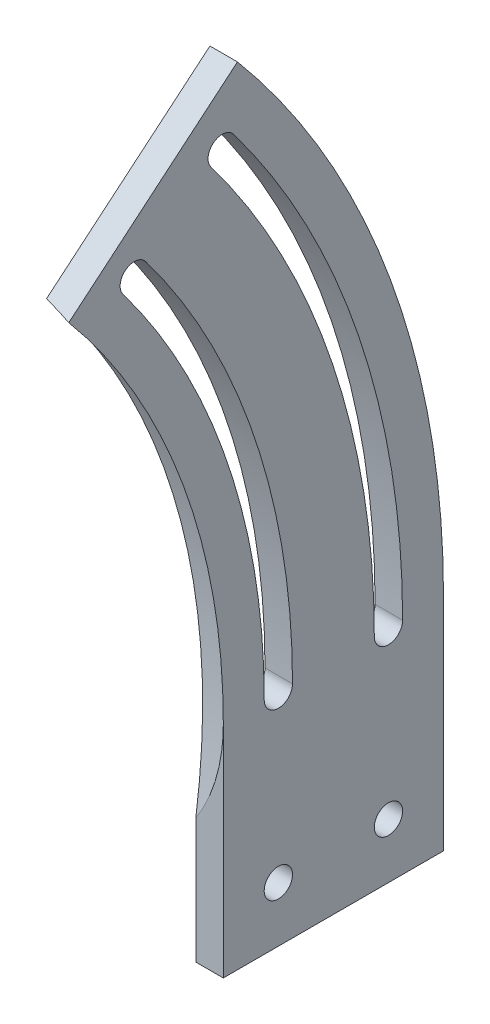
ISO-10303-21;
HEADER;
FILE_DESCRIPTION(('STEP AP214'),'2;1');
FILE_NAME('part.step','',(''),(''),'','','');
FILE_SCHEMA(('AUTOMOTIVE_DESIGN { 1 0 10303 214 1 1 1 1 }'));
ENDSEC;
DATA;
#1=APPLICATION_CONTEXT('core data for automotive mechanical design processes');
#2=APPLICATION_PROTOCOL_DEFINITION('international standard','automotive_design',2000,#1);
#3=PRODUCT_CONTEXT('',#1,'mechanical');
#4=PRODUCT('Part','Part','',(#3));
#5=PRODUCT_RELATED_PRODUCT_CATEGORY('part','',(#4));
#6=PRODUCT_DEFINITION_FORMATION('','',#4);
#7=PRODUCT_DEFINITION_CONTEXT('part definition',#1,'design');
#8=PRODUCT_DEFINITION('design','',#6,#7);
#9=PRODUCT_DEFINITION_SHAPE('','',#8);
#10=(LENGTH_UNIT() NAMED_UNIT(*) SI_UNIT(.MILLI.,.METRE.));
#11=(NAMED_UNIT(*) PLANE_ANGLE_UNIT() SI_UNIT($,.RADIAN.));
#12=(NAMED_UNIT(*) SI_UNIT($,.STERADIAN.) SOLID_ANGLE_UNIT());
#13=UNCERTAINTY_MEASURE_WITH_UNIT(LENGTH_MEASURE(1.E-05),#10,'distance_accuracy_value','');
#14=(GEOMETRIC_REPRESENTATION_CONTEXT(3) GLOBAL_UNCERTAINTY_ASSIGNED_CONTEXT((#13)) GLOBAL_UNIT_ASSIGNED_CONTEXT((#10,
#11,#12)) REPRESENTATION_CONTEXT('',''));
#15=CARTESIAN_POINT('',(0.,0.,0.));
#16=DIRECTION('',(0.,0.,1.));
#17=DIRECTION('',(1.,0.,0.));
#18=AXIS2_PLACEMENT_3D('',#15,#16,#17);
#19=CARTESIAN_POINT('',(6.35,0.,-152.4));
#20=DIRECTION('',(0.,0.,-1.));
#21=DIRECTION('',(0.,1.,0.));
#22=AXIS2_PLACEMENT_3D('',#19,#20,#21);
#23=PLANE('',#22);
#24=CARTESIAN_POINT('',(-51.1955367016958,-21.3572265494078,-152.4));
#25=CARTESIAN_POINT('',(-50.739451732847,-22.0894225163252,-152.4));
#26=CARTESIAN_POINT('',(-50.2575058321623,-22.8056791597008,-152.4));
#27=CARTESIAN_POINT('',(-49.2428724416584,-24.2017923620183,-152.4));
#28=CARTESIAN_POINT('',(-48.7101610675442,-24.881631549852,-152.4));
#29=CARTESIAN_POINT('',(-47.5932215128379,-26.2022751389875,-152.4));
#30=CARTESIAN_POINT('',(-47.0087992174357,-26.8429157446944,-152.4));
#31=CARTESIAN_POINT('',(-45.7921610963305,-28.0769830649458,-152.4));
#32=CARTESIAN_POINT('',(-45.1599517690021,-28.6704161766102,-152.4));
#33=CARTESIAN_POINT('',(-43.8480578541147,-29.806620421023,-152.4));
#34=CARTESIAN_POINT('',(-43.1682336700565,-30.349230670142,-152.4));
#35=CARTESIAN_POINT('',(-41.7660201959369,-31.3763138204137,-152.4));
#36=CARTESIAN_POINT('',(-41.0436346528798,-31.860791828026,-152.4));
#37=CARTESIAN_POINT('',(-39.5611675452973,-32.7657771387012,-152.4));
#38=CARTESIAN_POINT('',(-38.8011401710304,-33.1863730510988,-152.4));
#39=CARTESIAN_POINT('',(-37.2471568982568,-33.959444638842,-152.4));
#40=CARTESIAN_POINT('',(-36.4532019216506,-34.3119221637043,-152.4));
#41=CARTESIAN_POINT('',(-34.8413643265246,-34.9425307343219,-152.4));
#42=CARTESIAN_POINT('',(-34.0236402262284,-35.2210662620235,-152.4));
#43=CARTESIAN_POINT('',(-32.3662025899778,-35.7026522661605,-152.4));
#44=CARTESIAN_POINT('',(-31.5264888055659,-35.9057018893001,-152.4));
#45=CARTESIAN_POINT('',(-29.8318040354599,-36.2334794545331,-152.4));
#46=CARTESIAN_POINT('',(-28.9768315838681,-36.3581998294393,-152.4));
#47=CARTESIAN_POINT('',(-27.2590111531623,-36.5274678261313,-152.4));
#48=CARTESIAN_POINT('',(-26.3961637620154,-36.5720213849896,-152.4));
#49=CARTESIAN_POINT('',(-24.7416213384114,-36.5799866084048,-152.4));
#50=CARTESIAN_POINT('',(-23.9499500987589,-36.5498110246751,-152.4));
#51=CARTESIAN_POINT('',(-22.3720822616352,-36.4218775328711,-152.4));
#52=CARTESIAN_POINT('',(-21.5858856233443,-36.324120129247,-152.4));
#53=CARTESIAN_POINT('',(-20.0248683636398,-36.0622553569607,-152.4));
#54=CARTESIAN_POINT('',(-19.2500446691536,-35.8981662669566,-152.4));
#55=CARTESIAN_POINT('',(-17.7168961781748,-35.5055938159728,-152.4));
#56=CARTESIAN_POINT('',(-16.9585716717874,-35.2771093237128,-152.4));
#57=CARTESIAN_POINT('',(-15.4682678873885,-34.7600598665606,-152.4));
#58=CARTESIAN_POINT('',(-14.7361490848752,-34.4718963021139,-152.4));
#59=CARTESIAN_POINT('',(-13.2972245470062,-33.8375911970875,-152.4));
#60=CARTESIAN_POINT('',(-12.5904272781972,-33.4914304800992,-152.4));
#61=CARTESIAN_POINT('',(-11.2062599592385,-32.7447056161009,-152.4));
#62=CARTESIAN_POINT('',(-10.5288886649075,-32.3441437722258,-152.4));
#63=CARTESIAN_POINT('',(-9.2067726297596,-31.4923503508894,-152.4));
#64=CARTESIAN_POINT('',(-8.56203104909503,-31.0411138792165,-152.4));
#65=CARTESIAN_POINT('',(-7.26401361837018,-30.0586208305878,-152.4));
#66=CARTESIAN_POINT('',(-6.61330123013709,-29.5239735698421,-152.4));
#67=CARTESIAN_POINT('',(-5.35521664155007,-28.4061376843006,-152.4));
#68=CARTESIAN_POINT('',(-4.74784705364586,-27.8229461381221,-152.4));
#69=CARTESIAN_POINT('',(-2.99380302479877,-26.0074480329552,-152.4));
#70=CARTESIAN_POINT('',(-1.91470311788277,-24.7088426589336,-152.4));
#71=CARTESIAN_POINT('',(0.166870016254947,-21.8107568080292,-152.4));
#72=CARTESIAN_POINT('',(1.1449206210091,-20.1938623136072,-152.4));
#73=CARTESIAN_POINT('',(2.85205609538777,-16.8338027612673,-152.4));
#74=CARTESIAN_POINT('',(3.58101372831316,-15.0905737210389,-152.4));
#75=CARTESIAN_POINT('',(4.86622023174582,-11.2846019233035,-152.4));
#76=CARTESIAN_POINT('',(5.38741157982472,-9.20988945054139,-152.4));
#77=CARTESIAN_POINT('',(5.92721641167764,-6.05842631625213,-152.4));
#78=CARTESIAN_POINT('',(6.06683171408185,-5.0007429039643,-152.4));
#79=CARTESIAN_POINT('',(6.26555240345397,-2.87745357175987,-152.4));
#80=CARTESIAN_POINT('',(6.32464724128154,-1.81184663215085,-152.4));
#81=CARTESIAN_POINT('',(6.36398866264646,0.421063938041402,-152.4));
#82=CARTESIAN_POINT('',(6.3362984945147,1.58850822453379,-152.4));
#83=CARTESIAN_POINT('',(6.18446032010339,3.91674810883341,-152.4));
#84=CARTESIAN_POINT('',(6.06034273900943,5.07754568748027,-152.4));
#85=CARTESIAN_POINT('',(5.71554381422632,7.38531678517258,-152.4));
#86=CARTESIAN_POINT('',(5.49481623661442,8.53228341486452,-152.4));
#87=CARTESIAN_POINT('',(4.95672681373427,10.8035081270583,-152.4));
#88=CARTESIAN_POINT('',(4.63935441951749,11.9277637163191,-152.4));
#89=CARTESIAN_POINT('',(3.90538304842768,14.1526778779405,-152.4));
#90=CARTESIAN_POINT('',(3.48807101442847,15.2531019006552,-152.4));
#91=CARTESIAN_POINT('',(2.55609734623251,17.4114358215481,-152.4));
#92=CARTESIAN_POINT('',(2.04148075963394,18.4693651191591,-152.4));
#93=CARTESIAN_POINT('',(0.915744694466218,20.5326289146142,-152.4));
#94=CARTESIAN_POINT('',(0.304630558537806,21.5379663201377,-152.4));
#95=CARTESIAN_POINT('',(-1.0123058628112,23.4846138504678,-152.4));
#96=CARTESIAN_POINT('',(-1.71811497811355,24.425932851529,-152.4));
#97=CARTESIAN_POINT('',(-3.15071984629156,26.1474094629037,-152.4));
#98=CARTESIAN_POINT('',(-3.86930711818705,26.9343988307223,-152.4));
#99=CARTESIAN_POINT('',(-5.37828327122894,28.436181403678,-152.4));
#100=CARTESIAN_POINT('',(-6.16865846278739,29.1509883189642,-152.4));
#101=CARTESIAN_POINT('',(-7.81576618805048,30.498053463033,-152.4));
#102=CARTESIAN_POINT('',(-8.67243553918079,31.1303887855993,-152.4));
#103=CARTESIAN_POINT('',(-10.4463641726578,32.3034463877181,-152.4));
#104=CARTESIAN_POINT('',(-11.3636117080351,32.8441863568334,-152.4));
#105=CARTESIAN_POINT('',(-13.1134586856026,33.7535986732575,-152.4));
#106=CARTESIAN_POINT('',(-13.9390200612703,34.1358540176506,-152.4));
#107=CARTESIAN_POINT('',(-15.6222473912675,34.8214471457727,-152.4));
#108=CARTESIAN_POINT('',(-16.4799081062594,35.1247977448343,-152.4));
#109=CARTESIAN_POINT('',(-18.2197338413811,35.6479925991738,-152.4));
#110=CARTESIAN_POINT('',(-19.1018819836816,35.8678929102582,-152.4));
#111=CARTESIAN_POINT('',(-20.883350306608,36.2210624613766,-152.4));
#112=CARTESIAN_POINT('',(-21.7826689555862,36.3543393915893,-152.4));
#113=CARTESIAN_POINT('',(-23.4878497092382,36.5221155696439,-152.4));
#114=CARTESIAN_POINT('',(-24.2927948007923,36.5660712552367,-152.4));
#115=CARTESIAN_POINT('',(-25.9034341145282,36.5836293254637,-152.4));
#116=CARTESIAN_POINT('',(-26.7091282883884,36.557235970713,-152.4));
#117=CARTESIAN_POINT('',(-28.314956623733,36.4344506649693,-152.4));
#118=CARTESIAN_POINT('',(-29.1150920407977,36.3380750769121,-152.4));
#119=CARTESIAN_POINT('',(-30.7040412677746,36.0765670251842,-152.4));
#120=CARTESIAN_POINT('',(-31.4928550017528,35.911434100584,-152.4));
#121=CARTESIAN_POINT('',(-33.0301101186034,35.5204037849835,-152.4));
#122=CARTESIAN_POINT('',(-33.7790532622726,35.2964725930762,-152.4));
#123=CARTESIAN_POINT('',(-35.2564245037581,34.7882552729678,-152.4));
#124=CARTESIAN_POINT('',(-35.9848457279212,34.5039491886128,-152.4));
#125=CARTESIAN_POINT('',(-37.4164468705882,33.8781178018336,-152.4));
#126=CARTESIAN_POINT('',(-38.1196323405377,33.536605178749,-152.4));
#127=CARTESIAN_POINT('',(-39.497398361243,32.7996021695656,-152.4));
#128=CARTESIAN_POINT('',(-40.1719684248087,32.4040922143393,-152.4));
#129=CARTESIAN_POINT('',(-41.5234162405869,31.5408806975472,-152.4));
#130=CARTESIAN_POINT('',(-42.1985741936335,31.0704874540583,-152.4));
#131=CARTESIAN_POINT('',(-43.5104506850513,30.0783872672658,-152.4));
#132=CARTESIAN_POINT('',(-44.1471526521381,29.556658453691,-152.4));
#133=CARTESIAN_POINT('',(-45.3791011884411,28.4667503016864,-152.4));
#134=CARTESIAN_POINT('',(-45.9743590248369,27.8985836800744,-152.4));
#135=CARTESIAN_POINT('',(-47.1216639439498,26.7201381883011,-152.4));
#136=CARTESIAN_POINT('',(-47.6737069621981,26.1098553671314,-152.4));
#137=CARTESIAN_POINT('',(-48.7514246120716,24.8297234891564,-152.4));
#138=CARTESIAN_POINT('',(-49.2755124443894,24.1585404372844,-152.4));
#139=CARTESIAN_POINT('',(-50.27316714473,22.7823884578979,-152.4));
#140=CARTESIAN_POINT('',(-50.7468678019747,22.0775165897047,-152.4));
#141=CARTESIAN_POINT('',(-51.1955367016958,21.3572265494077,-152.4));
#142=B_SPLINE_CURVE_WITH_KNOTS('',3,(#24,#25,#26,#27,#28,#29,#30,#31,#32,#33,#34,#35,#36,#37,
#38,#39,#40,#41,#42,#43,#44,#45,#46,#47,#48,#49,#50,#51,#52,#53,#54,#55,#56,#57,#58,#59,#60,#61,
#62,#63,#64,#65,#66,#67,#68,#69,#70,#71,#72,#73,#74,#75,#76,#77,#78,#79,#80,#81,#82,#83,#84,#85,
#86,#87,#88,#89,#90,#91,#92,#93,#94,#95,#96,#97,#98,#99,#100,#101,#102,#103,#104,#105,#106,#107,
#108,#109,#110,#111,#112,#113,#114,#115,#116,#117,#118,#119,#120,#121,#122,#123,#124,#125,#126,
#127,#128,#129,#130,#131,#132,#133,#134,#135,#136,#137,#138,#139,#140,#141),.UNSPECIFIED.,.F.,
.F.,(4,2,2,2,2,2,2,2,2,2,2,2,2,2,2,2,2,2,2,2,2,2,2,2,2,2,2,2,2,2,2,2,2,2,2,2,2,2,2,2,2,2,2,2,2,
2,2,2,2,2,2,2,2,2,2,2,2,2,4),(0.,2.5875618813851,5.17634723436328,7.77530002880976,
10.3739000353089,12.9804661778928,15.5868031862836,18.1894913259688,20.7921087888212,
23.3801813395065,25.9682831449846,28.5566349418742,31.1447950401843,33.518667589617,
35.8925224199661,38.2657235456265,40.6389663656147,42.9967370425477,45.3552888462046,
47.7137408289361,50.072420789781,52.5962552932966,55.1202417904861,60.1663817882681,
65.8133591235492,71.4632166382867,77.8520093242308,81.0501477150387,84.2487050598109,
87.7480282620807,91.2462477912733,94.7461432707841,98.2464209069425,101.772458417723,
105.296867512124,108.821081544021,112.344805937562,115.537318405187,118.729223350149,
121.918122809365,125.106405701141,127.831914827129,130.556981012126,133.28021344292,
136.003204079813,138.418640618784,140.833930872725,143.248656575963,145.663398467088,
148.005881087945,150.349139195209,152.691878624906,155.035469349798,157.501469974996,
159.968525766371,162.43490821302,164.901522351506,167.45399876919,169.999519084908),.UNSPECIFIED.);
#143=CARTESIAN_POINT('',(0.,-21.978203216055,-152.4));
#144=VERTEX_POINT('',#143);
#145=CARTESIAN_POINT('',(6.34999999999997,1.9577939133142E-11,-152.4));
#146=VERTEX_POINT('',#145);
#147=EDGE_CURVE('E140',#144,#146,#142,.T.);
#148=ORIENTED_EDGE('',*,*,#147,.F.);
#149=DIRECTION('',(0.,-1.,0.));
#150=VECTOR('',#149,1.);
#151=CARTESIAN_POINT('',(0.,0.,-152.4));
#152=LINE('',#151,#150);
#153=CARTESIAN_POINT('',(0.,-50.8,-152.4));
#154=VERTEX_POINT('',#153);
#155=EDGE_CURVE('E148',#144,#154,#152,.T.);
#156=ORIENTED_EDGE('',*,*,#155,.T.);
#157=DIRECTION('',(-1.,0.,0.));
#158=VECTOR('',#157,1.);
#159=CARTESIAN_POINT('',(6.35,-50.8,-152.4));
#160=LINE('',#159,#158);
#161=CARTESIAN_POINT('',(6.35,-50.8,-152.4));
#162=VERTEX_POINT('',#161);
#163=EDGE_CURVE('E173',#162,#154,#160,.T.);
#164=ORIENTED_EDGE('',*,*,#163,.F.);
#165=DIRECTION('',(0.,-1.,0.));
#166=VECTOR('',#165,1.);
#167=CARTESIAN_POINT('',(6.35,0.,-152.4));
#168=LINE('',#167,#166);
#169=EDGE_CURVE('E150',#146,#162,#168,.T.);
#170=ORIENTED_EDGE('',*,*,#169,.F.);
#171=EDGE_LOOP('',(#148,#156,#164,#170));
#172=FACE_BOUND('',#171,.T.);
#173=ADVANCED_FACE('F41',(#172),#23,.F.);
#174=CARTESIAN_POINT('',(6.35,0.,0.));
#175=DIRECTION('',(-1.,0.,0.));
#176=DIRECTION('',(0.,0.,1.));
#177=AXIS2_PLACEMENT_3D('',#174,#175,#176);
#178=CYLINDRICAL_SURFACE('',#177,203.2);
#179=CARTESIAN_POINT('',(0.,0.,0.));
#180=DIRECTION('',(1.,0.,0.));
#181=DIRECTION('',(0.,0.,1.));
#182=AXIS2_PLACEMENT_3D('',#179,#180,#181);
#183=CIRCLE('',#182,203.2);
#184=CARTESIAN_POINT('',(0.,0.,-203.2));
#185=VERTEX_POINT('',#184);
#186=CARTESIAN_POINT('',(0.,130.614442288305,-155.660230841776));
#187=VERTEX_POINT('',#186);
#188=EDGE_CURVE('E160',#185,#187,#183,.T.);
#189=ORIENTED_EDGE('',*,*,#188,.T.);
#190=DIRECTION('',(-1.,0.,0.));
#191=VECTOR('',#190,1.);
#192=CARTESIAN_POINT('',(6.35,130.614442288305,-155.660230841776));
#193=LINE('',#192,#191);
#194=CARTESIAN_POINT('',(6.35,130.614442288305,-155.660230841776));
#195=VERTEX_POINT('',#194);
#196=EDGE_CURVE('E49',#195,#187,#193,.T.);
#197=ORIENTED_EDGE('',*,*,#196,.F.);
#198=CARTESIAN_POINT('',(6.35,0.,0.));
#199=DIRECTION('',(1.,0.,0.));
#200=DIRECTION('',(0.,0.,1.));
#201=AXIS2_PLACEMENT_3D('',#198,#199,#200);
#202=CIRCLE('',#201,203.2);
#203=CARTESIAN_POINT('',(6.35,0.,-203.2));
#204=VERTEX_POINT('',#203);
#205=EDGE_CURVE('E165',#204,#195,#202,.T.);
#206=ORIENTED_EDGE('',*,*,#205,.F.);
#207=DIRECTION('',(-1.,0.,0.));
#208=VECTOR('',#207,1.);
#209=CARTESIAN_POINT('',(6.35,0.,-203.2));
#210=LINE('',#209,#208);
#211=EDGE_CURVE('E166',#204,#185,#210,.T.);
#212=ORIENTED_EDGE('',*,*,#211,.T.);
#213=EDGE_LOOP('',(#189,#197,#206,#212));
#214=FACE_BOUND('',#213,.T.);
#215=ADVANCED_FACE('F43',(#214),#178,.T.);
#216=CARTESIAN_POINT('',(6.35,97.9608317162289,-116.745173131332));
#217=DIRECTION('',(0.,-0.766044443118976,-0.642787609686541));
#218=DIRECTION('',(0.,0.642787609686541,-0.766044443118977));
#219=AXIS2_PLACEMENT_3D('',#216,#217,#218);
#220=PLANE('',#219);
#221=CARTESIAN_POINT('',(-25.4,24.4902079290572,-29.186293282833));
#222=DIRECTION('',(0.,-0.766044443118976,-0.642787609686541));
#223=DIRECTION('',(0.,0.642787609686541,-0.766044443118977));
#224=AXIS2_PLACEMENT_3D('',#221,#222,#223);
#225=CIRCLE('',#224,118.627789745911);
#226=CARTESIAN_POINT('',(6.35000000000001,97.9608317162289,-116.745173131332));
#227=VERTEX_POINT('',#226);
#228=CARTESIAN_POINT('',(0.,98.974267504098,-117.952938872389));
#229=VERTEX_POINT('',#228);
#230=EDGE_CURVE('E56',#227,#229,#225,.F.);
#231=ORIENTED_EDGE('',*,*,#230,.F.);
#232=DIRECTION('',(0.,-0.642787609686541,0.766044443118977));
#233=VECTOR('',#232,1.);
#234=CARTESIAN_POINT('',(6.35,97.9608317162289,-116.745173131332));
#235=LINE('',#234,#233);
#236=EDGE_CURVE('E180',#195,#227,#235,.T.);
#237=ORIENTED_EDGE('',*,*,#236,.F.);
#238=ORIENTED_EDGE('',*,*,#196,.T.);
#239=DIRECTION('',(0.,-0.642787609686541,0.766044443118977));
#240=VECTOR('',#239,1.);
#241=CARTESIAN_POINT('',(0.,97.9608317162289,-116.745173131332));
#242=LINE('',#241,#240);
#243=EDGE_CURVE('E156',#187,#229,#242,.T.);
#244=ORIENTED_EDGE('',*,*,#243,.T.);
#245=EDGE_LOOP('',(#231,#237,#238,#244));
#246=FACE_BOUND('',#245,.T.);
#247=ADVANCED_FACE('F178',(#246),#220,.F.);
#248=CARTESIAN_POINT('',(6.35,-50.8,-152.4));
#249=DIRECTION('',(0.,1.,0.));
#250=DIRECTION('',(0.,0.,1.));
#251=AXIS2_PLACEMENT_3D('',#248,#249,#250);
#252=PLANE('',#251);
#253=DIRECTION('',(0.,0.,-1.));
#254=VECTOR('',#253,1.);
#255=CARTESIAN_POINT('',(0.,-50.8,-152.4));
#256=LINE('',#255,#254);
#257=CARTESIAN_POINT('',(0.,-50.8,-203.2));
#258=VERTEX_POINT('',#257);
#259=EDGE_CURVE('E155',#154,#258,#256,.T.);
#260=ORIENTED_EDGE('',*,*,#259,.T.);
#261=DIRECTION('',(-1.,0.,0.));
#262=VECTOR('',#261,1.);
#263=CARTESIAN_POINT('',(6.35,-50.8,-203.2));
#264=LINE('',#263,#262);
#265=CARTESIAN_POINT('',(6.35,-50.8,-203.2));
#266=VERTEX_POINT('',#265);
#267=EDGE_CURVE('E169',#266,#258,#264,.T.);
#268=ORIENTED_EDGE('',*,*,#267,.F.);
#269=DIRECTION('',(0.,0.,-1.));
#270=VECTOR('',#269,1.);
#271=CARTESIAN_POINT('',(6.35,-50.8,-152.4));
#272=LINE('',#271,#270);
#273=EDGE_CURVE('E191',#162,#266,#272,.T.);
#274=ORIENTED_EDGE('',*,*,#273,.F.);
#275=ORIENTED_EDGE('',*,*,#163,.T.);
#276=EDGE_LOOP('',(#260,#268,#274,#275));
#277=FACE_BOUND('',#276,.T.);
#278=ADVANCED_FACE('F328',(#277),#252,.F.);
#279=CARTESIAN_POINT('',(6.35,-50.8,-203.2));
#280=DIRECTION('',(0.,0.,1.));
#281=DIRECTION('',(1.,0.,0.));
#282=AXIS2_PLACEMENT_3D('',#279,#280,#281);
#283=PLANE('',#282);
#284=DIRECTION('',(0.,1.,0.));
#285=VECTOR('',#284,1.);
#286=CARTESIAN_POINT('',(0.,-50.8,-203.2));
#287=LINE('',#286,#285);
#288=EDGE_CURVE('E158',#258,#185,#287,.T.);
#289=ORIENTED_EDGE('',*,*,#288,.T.);
#290=ORIENTED_EDGE('',*,*,#211,.F.);
#291=DIRECTION('',(0.,1.,0.));
#292=VECTOR('',#291,1.);
#293=CARTESIAN_POINT('',(6.35,-50.8,-203.2));
#294=LINE('',#293,#292);
#295=EDGE_CURVE('E170',#266,#204,#294,.T.);
#296=ORIENTED_EDGE('',*,*,#295,.F.);
#297=ORIENTED_EDGE('',*,*,#267,.T.);
#298=EDGE_LOOP('',(#289,#290,#296,#297));
#299=FACE_BOUND('',#298,.T.);
#300=ADVANCED_FACE('F322',(#299),#283,.F.);
#301=CARTESIAN_POINT('',(6.35,0.,0.));
#302=DIRECTION('',(-1.,0.,0.));
#303=DIRECTION('',(0.,0.,1.));
#304=AXIS2_PLACEMENT_3D('',#301,#302,#303);
#305=PLANE('',#304);
#306=CARTESIAN_POINT('',(6.35,-38.1,-165.1));
#307=DIRECTION('',(1.,0.,0.));
#308=DIRECTION('',(0.,0.,-1.));
#309=AXIS2_PLACEMENT_3D('',#306,#307,#308);
#310=CIRCLE('',#309,3.26389999999998);
#311=CARTESIAN_POINT('',(6.35,-38.1,-168.3639));
#312=VERTEX_POINT('',#311);
#313=EDGE_CURVE('E264',#312,#312,#310,.T.);
#314=ORIENTED_EDGE('',*,*,#313,.F.);
#315=EDGE_LOOP('',(#314));
#316=FACE_BOUND('',#315,.T.);
#317=CARTESIAN_POINT('',(6.35,-38.1,-190.5));
#318=DIRECTION('',(1.,0.,0.));
#319=DIRECTION('',(0.,0.,-1.));
#320=AXIS2_PLACEMENT_3D('',#317,#318,#319);
#321=CIRCLE('',#320,3.26390000000001);
#322=CARTESIAN_POINT('',(6.35,-38.1,-193.7639));
#323=VERTEX_POINT('',#322);
#324=EDGE_CURVE('E258',#323,#323,#321,.T.);
#325=ORIENTED_EDGE('',*,*,#324,.F.);
#326=EDGE_LOOP('',(#325));
#327=FACE_BOUND('',#326,.T.);
#328=CARTESIAN_POINT('',(6.35,0.,-190.5));
#329=DIRECTION('',(1.,0.,0.));
#330=DIRECTION('',(0.,0.,-1.));
#331=AXIS2_PLACEMENT_3D('',#328,#329,#330);
#332=CIRCLE('',#331,3.26390000000003);
#333=CARTESIAN_POINT('',(6.35,0.,-187.2361));
#334=VERTEX_POINT('',#333);
#335=CARTESIAN_POINT('',(6.35,0.,-193.7639));
#336=VERTEX_POINT('',#335);
#337=EDGE_CURVE('E243',#334,#336,#332,.T.);
#338=ORIENTED_EDGE('',*,*,#337,.F.);
#339=CARTESIAN_POINT('',(6.35,0.,0.));
#340=DIRECTION('',(-1.,0.,0.));
#341=DIRECTION('',(0.,0.,1.));
#342=AXIS2_PLACEMENT_3D('',#339,#340,#341);
#343=CIRCLE('',#342,187.2361);
#344=CARTESIAN_POINT('',(6.35,112.6814978564,-149.533398222766));
#345=VERTEX_POINT('',#344);
#346=EDGE_CURVE('E63',#345,#334,#343,.T.);
#347=ORIENTED_EDGE('',*,*,#346,.F.);
#348=CARTESIAN_POINT('',(6.35,114.645761910465,-152.140064664009));
#349=DIRECTION('',(1.,0.,0.));
#350=DIRECTION('',(0.,0.,-1.));
#351=AXIS2_PLACEMENT_3D('',#348,#349,#350);
#352=CIRCLE('',#351,3.2639);
#353=CARTESIAN_POINT('',(6.35,116.610025964531,-154.746731105252));
#354=VERTEX_POINT('',#353);
#355=EDGE_CURVE('E236',#354,#345,#352,.T.);
#356=ORIENTED_EDGE('',*,*,#355,.F.);
#357=CARTESIAN_POINT('',(6.35,0.,0.));
#358=DIRECTION('',(1.,0.,0.));
#359=DIRECTION('',(0.,0.,1.));
#360=AXIS2_PLACEMENT_3D('',#357,#358,#359);
#361=CIRCLE('',#360,193.7639);
#362=EDGE_CURVE('E240',#336,#354,#361,.T.);
#363=ORIENTED_EDGE('',*,*,#362,.F.);
#364=EDGE_LOOP('',(#338,#347,#356,#363));
#365=FACE_BOUND('',#364,.T.);
#366=CARTESIAN_POINT('',(6.35,0.,-165.1));
#367=DIRECTION('',(1.,0.,0.));
#368=DIRECTION('',(0.,0.,-1.));
#369=AXIS2_PLACEMENT_3D('',#366,#367,#368);
#370=CIRCLE('',#369,3.26390000000001);
#371=CARTESIAN_POINT('',(6.35,0.,-161.8361));
#372=VERTEX_POINT('',#371);
#373=CARTESIAN_POINT('',(6.35,0.,-168.3639));
#374=VERTEX_POINT('',#373);
#375=EDGE_CURVE('E212',#372,#374,#370,.T.);
#376=ORIENTED_EDGE('',*,*,#375,.F.);
#377=CARTESIAN_POINT('',(6.35,0.,0.));
#378=DIRECTION('',(-1.,0.,0.));
#379=DIRECTION('',(0.,0.,1.));
#380=AXIS2_PLACEMENT_3D('',#377,#378,#379);
#381=CIRCLE('',#380,161.8361);
#382=CARTESIAN_POINT('',(6.35,97.3953962683374,-129.248056267565));
#383=VERTEX_POINT('',#382);
#384=EDGE_CURVE('E215',#383,#372,#381,.T.);
#385=ORIENTED_EDGE('',*,*,#384,.F.);
#386=CARTESIAN_POINT('',(6.35,99.3596603224034,-131.854722708808));
#387=DIRECTION('',(1.,0.,0.));
#388=DIRECTION('',(0.,0.,-1.));
#389=AXIS2_PLACEMENT_3D('',#386,#387,#388);
#390=CIRCLE('',#389,3.2639);
#391=CARTESIAN_POINT('',(6.35,101.323924376469,-134.461389150051));
#392=VERTEX_POINT('',#391);
#393=EDGE_CURVE('E205',#392,#383,#390,.T.);
#394=ORIENTED_EDGE('',*,*,#393,.F.);
#395=CARTESIAN_POINT('',(6.35,0.,0.));
#396=DIRECTION('',(1.,0.,0.));
#397=DIRECTION('',(0.,0.,1.));
#398=AXIS2_PLACEMENT_3D('',#395,#396,#397);
#399=CIRCLE('',#398,168.3639);
#400=EDGE_CURVE('E209',#374,#392,#399,.T.);
#401=ORIENTED_EDGE('',*,*,#400,.F.);
#402=EDGE_LOOP('',(#376,#385,#394,#401));
#403=FACE_BOUND('',#402,.T.);
#404=ORIENTED_EDGE('',*,*,#205,.T.);
#405=ORIENTED_EDGE('',*,*,#236,.T.);
#406=CARTESIAN_POINT('',(6.35,0.,0.));
#407=DIRECTION('',(-1.,0.,0.));
#408=DIRECTION('',(0.,0.,-1.));
#409=AXIS2_PLACEMENT_3D('',#406,#407,#408);
#410=CIRCLE('',#409,152.4);
#411=EDGE_CURVE('E194',#227,#146,#410,.T.);
#412=ORIENTED_EDGE('',*,*,#411,.T.);
#413=ORIENTED_EDGE('',*,*,#169,.T.);
#414=ORIENTED_EDGE('',*,*,#273,.T.);
#415=ORIENTED_EDGE('',*,*,#295,.T.);
#416=EDGE_LOOP('',(#404,#405,#412,#413,#414,#415));
#417=FACE_BOUND('',#416,.T.);
#418=ADVANCED_FACE('F319',(#316,#327,#365,#403,#417),#305,.F.);
#419=CARTESIAN_POINT('',(0.,0.,0.));
#420=DIRECTION('',(-1.,0.,0.));
#421=DIRECTION('',(0.,0.,1.));
#422=AXIS2_PLACEMENT_3D('',#419,#420,#421);
#423=PLANE('',#422);
#424=CARTESIAN_POINT('',(0.,-38.1,-165.1));
#425=DIRECTION('',(1.,0.,0.));
#426=DIRECTION('',(0.,0.,-1.));
#427=AXIS2_PLACEMENT_3D('',#424,#425,#426);
#428=CIRCLE('',#427,3.26389999999998);
#429=CARTESIAN_POINT('',(0.,-38.1,-168.3639));
#430=VERTEX_POINT('',#429);
#431=EDGE_CURVE('E247',#430,#430,#428,.T.);
#432=ORIENTED_EDGE('',*,*,#431,.T.);
#433=EDGE_LOOP('',(#432));
#434=FACE_BOUND('',#433,.T.);
#435=CARTESIAN_POINT('',(0.,-38.1,-190.5));
#436=DIRECTION('',(1.,0.,0.));
#437=DIRECTION('',(0.,0.,-1.));
#438=AXIS2_PLACEMENT_3D('',#435,#436,#437);
#439=CIRCLE('',#438,3.26390000000001);
#440=CARTESIAN_POINT('',(0.,-38.1,-193.7639));
#441=VERTEX_POINT('',#440);
#442=EDGE_CURVE('E261',#441,#441,#439,.T.);
#443=ORIENTED_EDGE('',*,*,#442,.T.);
#444=EDGE_LOOP('',(#443));
#445=FACE_BOUND('',#444,.T.);
#446=CARTESIAN_POINT('',(0.,0.,0.));
#447=DIRECTION('',(-1.,0.,0.));
#448=DIRECTION('',(0.,0.,1.));
#449=AXIS2_PLACEMENT_3D('',#446,#447,#448);
#450=CIRCLE('',#449,187.2361);
#451=CARTESIAN_POINT('',(0.,112.6814978564,-149.533398222766));
#452=VERTEX_POINT('',#451);
#453=CARTESIAN_POINT('',(0.,0.,-187.2361));
#454=VERTEX_POINT('',#453);
#455=EDGE_CURVE('E239',#452,#454,#450,.T.);
#456=ORIENTED_EDGE('',*,*,#455,.T.);
#457=CARTESIAN_POINT('',(0.,0.,-190.5));
#458=DIRECTION('',(1.,0.,0.));
#459=DIRECTION('',(0.,0.,-1.));
#460=AXIS2_PLACEMENT_3D('',#457,#458,#459);
#461=CIRCLE('',#460,3.26390000000003);
#462=CARTESIAN_POINT('',(0.,0.,-193.7639));
#463=VERTEX_POINT('',#462);
#464=EDGE_CURVE('E253',#454,#463,#461,.T.);
#465=ORIENTED_EDGE('',*,*,#464,.T.);
#466=CARTESIAN_POINT('',(0.,0.,0.));
#467=DIRECTION('',(1.,0.,0.));
#468=DIRECTION('',(0.,0.,1.));
#469=AXIS2_PLACEMENT_3D('',#466,#467,#468);
#470=CIRCLE('',#469,193.7639);
#471=CARTESIAN_POINT('',(0.,116.610025964531,-154.746731105252));
#472=VERTEX_POINT('',#471);
#473=EDGE_CURVE('E250',#463,#472,#470,.T.);
#474=ORIENTED_EDGE('',*,*,#473,.T.);
#475=CARTESIAN_POINT('',(0.,114.645761910465,-152.140064664009));
#476=DIRECTION('',(1.,0.,0.));
#477=DIRECTION('',(0.,0.,-1.));
#478=AXIS2_PLACEMENT_3D('',#475,#476,#477);
#479=CIRCLE('',#478,3.2639);
#480=EDGE_CURVE('E231',#472,#452,#479,.T.);
#481=ORIENTED_EDGE('',*,*,#480,.T.);
#482=EDGE_LOOP('',(#456,#465,#474,#481));
#483=FACE_BOUND('',#482,.T.);
#484=CARTESIAN_POINT('',(0.,0.,0.));
#485=DIRECTION('',(-1.,0.,0.));
#486=DIRECTION('',(0.,0.,1.));
#487=AXIS2_PLACEMENT_3D('',#484,#485,#486);
#488=CIRCLE('',#487,161.8361);
#489=CARTESIAN_POINT('',(0.,97.3953962683374,-129.248056267565));
#490=VERTEX_POINT('',#489);
#491=CARTESIAN_POINT('',(0.,0.,-161.8361));
#492=VERTEX_POINT('',#491);
#493=EDGE_CURVE('E208',#490,#492,#488,.T.);
#494=ORIENTED_EDGE('',*,*,#493,.T.);
#495=CARTESIAN_POINT('',(0.,0.,-165.1));
#496=DIRECTION('',(1.,0.,0.));
#497=DIRECTION('',(0.,0.,-1.));
#498=AXIS2_PLACEMENT_3D('',#495,#496,#497);
#499=CIRCLE('',#498,3.26390000000001);
#500=CARTESIAN_POINT('',(0.,0.,-168.3639));
#501=VERTEX_POINT('',#500);
#502=EDGE_CURVE('E223',#492,#501,#499,.T.);
#503=ORIENTED_EDGE('',*,*,#502,.T.);
#504=CARTESIAN_POINT('',(0.,0.,0.));
#505=DIRECTION('',(1.,0.,0.));
#506=DIRECTION('',(0.,0.,1.));
#507=AXIS2_PLACEMENT_3D('',#504,#505,#506);
#508=CIRCLE('',#507,168.3639);
#509=CARTESIAN_POINT('',(0.,101.323924376469,-134.461389150051));
#510=VERTEX_POINT('',#509);
#511=EDGE_CURVE('E220',#501,#510,#508,.T.);
#512=ORIENTED_EDGE('',*,*,#511,.T.);
#513=CARTESIAN_POINT('',(0.,99.3596603224034,-131.854722708808));
#514=DIRECTION('',(1.,0.,0.));
#515=DIRECTION('',(0.,0.,-1.));
#516=AXIS2_PLACEMENT_3D('',#513,#514,#515);
#517=CIRCLE('',#516,3.2639);
#518=EDGE_CURVE('E202',#510,#490,#517,.T.);
#519=ORIENTED_EDGE('',*,*,#518,.T.);
#520=EDGE_LOOP('',(#494,#503,#512,#519));
#521=FACE_BOUND('',#520,.T.);
#522=ORIENTED_EDGE('',*,*,#155,.F.);
#523=CARTESIAN_POINT('',(0.,0.,0.));
#524=DIRECTION('',(-1.,0.,0.));
#525=DIRECTION('',(0.,0.,1.));
#526=AXIS2_PLACEMENT_3D('',#523,#524,#525);
#527=CIRCLE('',#526,153.976626202181);
#528=EDGE_CURVE('E11',#144,#229,#527,.F.);
#529=ORIENTED_EDGE('',*,*,#528,.T.);
#530=ORIENTED_EDGE('',*,*,#243,.F.);
#531=ORIENTED_EDGE('',*,*,#188,.F.);
#532=ORIENTED_EDGE('',*,*,#288,.F.);
#533=ORIENTED_EDGE('',*,*,#259,.F.);
#534=EDGE_LOOP('',(#522,#529,#530,#531,#532,#533));
#535=FACE_BOUND('',#534,.T.);
#536=ADVANCED_FACE('F153',(#434,#445,#483,#521,#535),#423,.T.);
#537=CARTESIAN_POINT('',(0.,0.,0.));
#538=DIRECTION('',(1.,0.,0.));
#539=DIRECTION('',(0.,0.,-1.));
#540=AXIS2_PLACEMENT_3D('',#537,#538,#539);
#541=CYLINDRICAL_SURFACE('',#540,161.8361);
#542=ORIENTED_EDGE('',*,*,#384,.T.);
#543=DIRECTION('',(1.,0.,0.));
#544=VECTOR('',#543,1.);
#545=CARTESIAN_POINT('',(0.,0.,-161.8361));
#546=LINE('',#545,#544);
#547=EDGE_CURVE('E198',#492,#372,#546,.T.);
#548=ORIENTED_EDGE('',*,*,#547,.F.);
#549=ORIENTED_EDGE('',*,*,#493,.F.);
#550=DIRECTION('',(1.,0.,0.));
#551=VECTOR('',#550,1.);
#552=CARTESIAN_POINT('',(0.,97.3953962683374,-129.248056267565));
#553=LINE('',#552,#551);
#554=EDGE_CURVE('E186',#490,#383,#553,.T.);
#555=ORIENTED_EDGE('',*,*,#554,.T.);
#556=EDGE_LOOP('',(#542,#548,#549,#555));
#557=FACE_BOUND('',#556,.T.);
#558=ADVANCED_FACE('F308',(#557),#541,.T.);
#559=CARTESIAN_POINT('',(0.,99.3596603224034,-131.854722708808));
#560=DIRECTION('',(1.,0.,0.));
#561=DIRECTION('',(0.,0.,-1.));
#562=AXIS2_PLACEMENT_3D('',#559,#560,#561);
#563=CYLINDRICAL_SURFACE('',#562,3.2639);
#564=ORIENTED_EDGE('',*,*,#393,.T.);
#565=ORIENTED_EDGE('',*,*,#554,.F.);
#566=ORIENTED_EDGE('',*,*,#518,.F.);
#567=DIRECTION('',(1.,0.,0.));
#568=VECTOR('',#567,1.);
#569=CARTESIAN_POINT('',(0.,101.323924376469,-134.461389150051));
#570=LINE('',#569,#568);
#571=EDGE_CURVE('E187',#510,#392,#570,.T.);
#572=ORIENTED_EDGE('',*,*,#571,.T.);
#573=EDGE_LOOP('',(#564,#565,#566,#572));
#574=FACE_BOUND('',#573,.T.);
#575=ADVANCED_FACE('F304',(#574),#563,.F.);
#576=CARTESIAN_POINT('',(0.,0.,0.));
#577=DIRECTION('',(1.,0.,0.));
#578=DIRECTION('',(0.,0.,-1.));
#579=AXIS2_PLACEMENT_3D('',#576,#577,#578);
#580=CYLINDRICAL_SURFACE('',#579,168.3639);
#581=ORIENTED_EDGE('',*,*,#400,.T.);
#582=ORIENTED_EDGE('',*,*,#571,.F.);
#583=ORIENTED_EDGE('',*,*,#511,.F.);
#584=DIRECTION('',(1.,0.,0.));
#585=VECTOR('',#584,1.);
#586=CARTESIAN_POINT('',(0.,0.,-168.3639));
#587=LINE('',#586,#585);
#588=EDGE_CURVE('E201',#501,#374,#587,.T.);
#589=ORIENTED_EDGE('',*,*,#588,.T.);
#590=EDGE_LOOP('',(#581,#582,#583,#589));
#591=FACE_BOUND('',#590,.T.);
#592=ADVANCED_FACE('F307',(#591),#580,.F.);
#593=CARTESIAN_POINT('',(0.,0.,-165.1));
#594=DIRECTION('',(1.,0.,0.));
#595=DIRECTION('',(0.,0.,-1.));
#596=AXIS2_PLACEMENT_3D('',#593,#594,#595);
#597=CYLINDRICAL_SURFACE('',#596,3.26390000000001);
#598=ORIENTED_EDGE('',*,*,#375,.T.);
#599=ORIENTED_EDGE('',*,*,#588,.F.);
#600=ORIENTED_EDGE('',*,*,#502,.F.);
#601=ORIENTED_EDGE('',*,*,#547,.T.);
#602=EDGE_LOOP('',(#598,#599,#600,#601));
#603=FACE_BOUND('',#602,.T.);
#604=ADVANCED_FACE('F303',(#603),#597,.F.);
#605=CARTESIAN_POINT('',(0.,0.,0.));
#606=DIRECTION('',(1.,0.,0.));
#607=DIRECTION('',(0.,0.,-1.));
#608=AXIS2_PLACEMENT_3D('',#605,#606,#607);
#609=CYLINDRICAL_SURFACE('',#608,187.2361);
#610=ORIENTED_EDGE('',*,*,#346,.T.);
#611=DIRECTION('',(1.,0.,0.));
#612=VECTOR('',#611,1.);
#613=CARTESIAN_POINT('',(0.,0.,-187.2361));
#614=LINE('',#613,#612);
#615=EDGE_CURVE('E228',#454,#334,#614,.T.);
#616=ORIENTED_EDGE('',*,*,#615,.F.);
#617=ORIENTED_EDGE('',*,*,#455,.F.);
#618=DIRECTION('',(1.,0.,0.));
#619=VECTOR('',#618,1.);
#620=CARTESIAN_POINT('',(0.,112.6814978564,-149.533398222766));
#621=LINE('',#620,#619);
#622=EDGE_CURVE('E217',#452,#345,#621,.T.);
#623=ORIENTED_EDGE('',*,*,#622,.T.);
#624=EDGE_LOOP('',(#610,#616,#617,#623));
#625=FACE_BOUND('',#624,.T.);
#626=ADVANCED_FACE('F293',(#625),#609,.T.);
#627=CARTESIAN_POINT('',(0.,114.645761910465,-152.140064664009));
#628=DIRECTION('',(1.,0.,0.));
#629=DIRECTION('',(0.,0.,-1.));
#630=AXIS2_PLACEMENT_3D('',#627,#628,#629);
#631=CYLINDRICAL_SURFACE('',#630,3.2639);
#632=ORIENTED_EDGE('',*,*,#355,.T.);
#633=ORIENTED_EDGE('',*,*,#622,.F.);
#634=ORIENTED_EDGE('',*,*,#480,.F.);
#635=DIRECTION('',(1.,0.,0.));
#636=VECTOR('',#635,1.);
#637=CARTESIAN_POINT('',(0.,116.610025964531,-154.746731105252));
#638=LINE('',#637,#636);
#639=EDGE_CURVE('E233',#472,#354,#638,.T.);
#640=ORIENTED_EDGE('',*,*,#639,.T.);
#641=EDGE_LOOP('',(#632,#633,#634,#640));
#642=FACE_BOUND('',#641,.T.);
#643=ADVANCED_FACE('F289',(#642),#631,.F.);
#644=CARTESIAN_POINT('',(0.,0.,0.));
#645=DIRECTION('',(1.,0.,0.));
#646=DIRECTION('',(0.,0.,-1.));
#647=AXIS2_PLACEMENT_3D('',#644,#645,#646);
#648=CYLINDRICAL_SURFACE('',#647,193.7639);
#649=ORIENTED_EDGE('',*,*,#362,.T.);
#650=ORIENTED_EDGE('',*,*,#639,.F.);
#651=ORIENTED_EDGE('',*,*,#473,.F.);
#652=DIRECTION('',(1.,0.,0.));
#653=VECTOR('',#652,1.);
#654=CARTESIAN_POINT('',(0.,0.,-193.7639));
#655=LINE('',#654,#653);
#656=EDGE_CURVE('E230',#463,#336,#655,.T.);
#657=ORIENTED_EDGE('',*,*,#656,.T.);
#658=EDGE_LOOP('',(#649,#650,#651,#657));
#659=FACE_BOUND('',#658,.T.);
#660=ADVANCED_FACE('F292',(#659),#648,.F.);
#661=CARTESIAN_POINT('',(0.,0.,-190.5));
#662=DIRECTION('',(1.,0.,0.));
#663=DIRECTION('',(0.,0.,-1.));
#664=AXIS2_PLACEMENT_3D('',#661,#662,#663);
#665=CYLINDRICAL_SURFACE('',#664,3.26390000000003);
#666=ORIENTED_EDGE('',*,*,#337,.T.);
#667=ORIENTED_EDGE('',*,*,#656,.F.);
#668=ORIENTED_EDGE('',*,*,#464,.F.);
#669=ORIENTED_EDGE('',*,*,#615,.T.);
#670=EDGE_LOOP('',(#666,#667,#668,#669));
#671=FACE_BOUND('',#670,.T.);
#672=ADVANCED_FACE('F287',(#671),#665,.F.);
#673=CARTESIAN_POINT('',(0.,-38.1,-190.5));
#674=DIRECTION('',(1.,0.,0.));
#675=DIRECTION('',(0.,0.,-1.));
#676=AXIS2_PLACEMENT_3D('',#673,#674,#675);
#677=CYLINDRICAL_SURFACE('',#676,3.26390000000001);
#678=ORIENTED_EDGE('',*,*,#442,.F.);
#679=EDGE_LOOP('',(#678));
#680=FACE_BOUND('',#679,.T.);
#681=ORIENTED_EDGE('',*,*,#324,.T.);
#682=EDGE_LOOP('',(#681));
#683=FACE_BOUND('',#682,.T.);
#684=ADVANCED_FACE('F283',(#680,#683),#677,.F.);
#685=CARTESIAN_POINT('',(0.,-38.1,-165.1));
#686=DIRECTION('',(1.,0.,0.));
#687=DIRECTION('',(0.,0.,-1.));
#688=AXIS2_PLACEMENT_3D('',#685,#686,#687);
#689=CYLINDRICAL_SURFACE('',#688,3.26389999999998);
#690=ORIENTED_EDGE('',*,*,#431,.F.);
#691=EDGE_LOOP('',(#690));
#692=FACE_BOUND('',#691,.T.);
#693=ORIENTED_EDGE('',*,*,#313,.T.);
#694=EDGE_LOOP('',(#693));
#695=FACE_BOUND('',#694,.T.);
#696=ADVANCED_FACE('F280',(#692,#695),#689,.F.);
#697=CARTESIAN_POINT('',(-25.4,0.,0.));
#698=DIRECTION('',(-1.,0.,0.));
#699=DIRECTION('',(0.,0.,1.));
#700=AXIS2_PLACEMENT_3D('',#697,#698,#699);
#701=DEGENERATE_TOROIDAL_SURFACE('',#700,38.1,118.627789745911,.T.);
#702=ORIENTED_EDGE('',*,*,#230,.T.);
#703=ORIENTED_EDGE('',*,*,#528,.F.);
#704=ORIENTED_EDGE('',*,*,#147,.T.);
#705=ORIENTED_EDGE('',*,*,#411,.F.);
#706=EDGE_LOOP('',(#702,#703,#704,#705));
#707=FACE_BOUND('',#706,.T.);
#708=ADVANCED_FACE('F139',(#707),#701,.F.);
#709=CLOSED_SHELL('',(#173,#215,#247,#278,#300,#418,#536,#558,#575,#592,#604,#626,#643,#660,
#672,#684,#696,#708));
#710=MANIFOLD_SOLID_BREP('B2',#709);
#711=ADVANCED_BREP_SHAPE_REPRESENTATION('',(#18,#710),#14);
#712=SHAPE_DEFINITION_REPRESENTATION(#9,#711);
ENDSEC;
END-ISO-10303-21;
